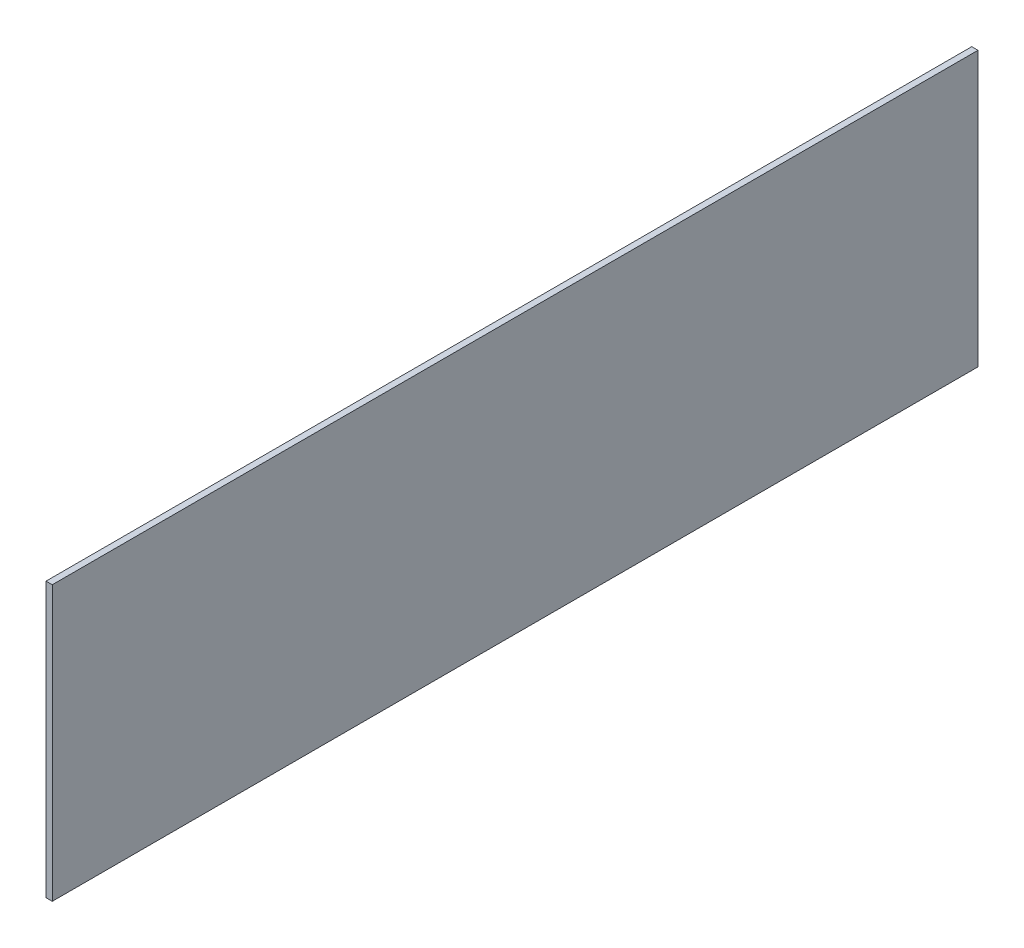
ISO-10303-21;
HEADER;
FILE_DESCRIPTION(('STEP AP214'),'2;1');
FILE_NAME('part.step','',(''),(''),'','','');
FILE_SCHEMA(('AUTOMOTIVE_DESIGN { 1 0 10303 214 1 1 1 1 }'));
ENDSEC;
DATA;
#1=APPLICATION_CONTEXT('core data for automotive mechanical design processes');
#2=APPLICATION_PROTOCOL_DEFINITION('international standard','automotive_design',2000,#1);
#3=PRODUCT_CONTEXT('',#1,'mechanical');
#4=PRODUCT('Part','Part','',(#3));
#5=PRODUCT_RELATED_PRODUCT_CATEGORY('part','',(#4));
#6=PRODUCT_DEFINITION_FORMATION('','',#4);
#7=PRODUCT_DEFINITION_CONTEXT('part definition',#1,'design');
#8=PRODUCT_DEFINITION('design','',#6,#7);
#9=PRODUCT_DEFINITION_SHAPE('','',#8);
#10=(LENGTH_UNIT() NAMED_UNIT(*) SI_UNIT(.MILLI.,.METRE.));
#11=(NAMED_UNIT(*) PLANE_ANGLE_UNIT() SI_UNIT($,.RADIAN.));
#12=(NAMED_UNIT(*) SI_UNIT($,.STERADIAN.) SOLID_ANGLE_UNIT());
#13=UNCERTAINTY_MEASURE_WITH_UNIT(LENGTH_MEASURE(1.E-05),#10,'distance_accuracy_value','');
#14=(GEOMETRIC_REPRESENTATION_CONTEXT(3) GLOBAL_UNCERTAINTY_ASSIGNED_CONTEXT((#13)) GLOBAL_UNIT_ASSIGNED_CONTEXT((#10,
#11,#12)) REPRESENTATION_CONTEXT('',''));
#15=CARTESIAN_POINT('',(0.,0.,0.));
#16=DIRECTION('',(0.,0.,1.));
#17=DIRECTION('',(1.,0.,0.));
#18=AXIS2_PLACEMENT_3D('',#15,#16,#17);
#19=CARTESIAN_POINT('',(-61.2631578947369,127.578947368421,1776.));
#20=DIRECTION('',(1.,0.,0.));
#21=DIRECTION('',(0.,1.,0.));
#22=AXIS2_PLACEMENT_3D('',#19,#20,#21);
#23=PLANE('',#22);
#24=DIRECTION('',(0.,-1.,0.));
#25=VECTOR('',#24,1.);
#26=CARTESIAN_POINT('',(-61.2631578947369,127.578947368421,0.));
#27=LINE('',#26,#25);
#28=CARTESIAN_POINT('',(-61.2631578947369,127.578947368421,0.));
#29=VERTEX_POINT('',#28);
#30=CARTESIAN_POINT('',(-61.2631578947369,-398.421052631579,0.));
#31=VERTEX_POINT('',#30);
#32=EDGE_CURVE('E107',#29,#31,#27,.T.);
#33=ORIENTED_EDGE('',*,*,#32,.T.);
#34=DIRECTION('',(0.,0.,-1.));
#35=VECTOR('',#34,1.);
#36=CARTESIAN_POINT('',(-61.2631578947369,-398.421052631579,1776.));
#37=LINE('',#36,#35);
#38=CARTESIAN_POINT('',(-61.2631578947369,-398.421052631579,1776.));
#39=VERTEX_POINT('',#38);
#40=EDGE_CURVE('E11',#39,#31,#37,.T.);
#41=ORIENTED_EDGE('',*,*,#40,.F.);
#42=DIRECTION('',(0.,-1.,0.));
#43=VECTOR('',#42,1.);
#44=CARTESIAN_POINT('',(-61.2631578947369,127.578947368421,1776.));
#45=LINE('',#44,#43);
#46=CARTESIAN_POINT('',(-61.2631578947369,127.578947368421,1776.));
#47=VERTEX_POINT('',#46);
#48=EDGE_CURVE('E91',#47,#39,#45,.T.);
#49=ORIENTED_EDGE('',*,*,#48,.F.);
#50=DIRECTION('',(0.,0.,-1.));
#51=VECTOR('',#50,1.);
#52=CARTESIAN_POINT('',(-61.2631578947369,127.578947368421,1776.));
#53=LINE('',#52,#51);
#54=EDGE_CURVE('E103',#47,#29,#53,.T.);
#55=ORIENTED_EDGE('',*,*,#54,.T.);
#56=EDGE_LOOP('',(#33,#41,#49,#55));
#57=FACE_BOUND('',#56,.T.);
#58=ADVANCED_FACE('F39',(#57),#23,.F.);
#59=CARTESIAN_POINT('',(-61.2631578947369,-398.421052631579,1776.));
#60=DIRECTION('',(0.,1.,0.));
#61=DIRECTION('',(0.,0.,1.));
#62=AXIS2_PLACEMENT_3D('',#59,#60,#61);
#63=PLANE('',#62);
#64=DIRECTION('',(1.,0.,0.));
#65=VECTOR('',#64,1.);
#66=CARTESIAN_POINT('',(-61.2631578947369,-398.421052631579,0.));
#67=LINE('',#66,#65);
#68=CARTESIAN_POINT('',(-49.2631578947369,-398.421052631579,0.));
#69=VERTEX_POINT('',#68);
#70=EDGE_CURVE('E96',#31,#69,#67,.T.);
#71=ORIENTED_EDGE('',*,*,#70,.T.);
#72=DIRECTION('',(0.,0.,-1.));
#73=VECTOR('',#72,1.);
#74=CARTESIAN_POINT('',(-49.2631578947369,-398.421052631579,1776.));
#75=LINE('',#74,#73);
#76=CARTESIAN_POINT('',(-49.2631578947369,-398.421052631579,1776.));
#77=VERTEX_POINT('',#76);
#78=EDGE_CURVE('E48',#77,#69,#75,.T.);
#79=ORIENTED_EDGE('',*,*,#78,.F.);
#80=DIRECTION('',(1.,0.,0.));
#81=VECTOR('',#80,1.);
#82=CARTESIAN_POINT('',(-61.2631578947369,-398.421052631579,1776.));
#83=LINE('',#82,#81);
#84=EDGE_CURVE('E86',#39,#77,#83,.T.);
#85=ORIENTED_EDGE('',*,*,#84,.F.);
#86=ORIENTED_EDGE('',*,*,#40,.T.);
#87=EDGE_LOOP('',(#71,#79,#85,#86));
#88=FACE_BOUND('',#87,.T.);
#89=ADVANCED_FACE('F95',(#88),#63,.F.);
#90=CARTESIAN_POINT('',(-49.2631578947369,127.578947368421,1776.));
#91=DIRECTION('',(-1.,0.,0.));
#92=DIRECTION('',(0.,-1.,0.));
#93=AXIS2_PLACEMENT_3D('',#90,#91,#92);
#94=PLANE('',#93);
#95=DIRECTION('',(0.,1.,0.));
#96=VECTOR('',#95,1.);
#97=CARTESIAN_POINT('',(-49.2631578947369,127.578947368421,0.));
#98=LINE('',#97,#96);
#99=CARTESIAN_POINT('',(-49.2631578947369,127.578947368421,0.));
#100=VERTEX_POINT('',#99);
#101=EDGE_CURVE('E73',#69,#100,#98,.T.);
#102=ORIENTED_EDGE('',*,*,#101,.T.);
#103=DIRECTION('',(0.,0.,-1.));
#104=VECTOR('',#103,1.);
#105=CARTESIAN_POINT('',(-49.2631578947369,127.578947368421,1776.));
#106=LINE('',#105,#104);
#107=CARTESIAN_POINT('',(-49.2631578947369,127.578947368421,1776.));
#108=VERTEX_POINT('',#107);
#109=EDGE_CURVE('E98',#108,#100,#106,.T.);
#110=ORIENTED_EDGE('',*,*,#109,.F.);
#111=DIRECTION('',(0.,1.,0.));
#112=VECTOR('',#111,1.);
#113=CARTESIAN_POINT('',(-49.2631578947369,127.578947368421,1776.));
#114=LINE('',#113,#112);
#115=EDGE_CURVE('E89',#77,#108,#114,.T.);
#116=ORIENTED_EDGE('',*,*,#115,.F.);
#117=ORIENTED_EDGE('',*,*,#78,.T.);
#118=EDGE_LOOP('',(#102,#110,#116,#117));
#119=FACE_BOUND('',#118,.T.);
#120=ADVANCED_FACE('F99',(#119),#94,.F.);
#121=CARTESIAN_POINT('',(-61.2631578947369,127.578947368421,1776.));
#122=DIRECTION('',(0.,-1.,0.));
#123=DIRECTION('',(0.,0.,-1.));
#124=AXIS2_PLACEMENT_3D('',#121,#122,#123);
#125=PLANE('',#124);
#126=DIRECTION('',(-1.,0.,0.));
#127=VECTOR('',#126,1.);
#128=CARTESIAN_POINT('',(-61.2631578947369,127.578947368421,0.));
#129=LINE('',#128,#127);
#130=EDGE_CURVE('E79',#100,#29,#129,.T.);
#131=ORIENTED_EDGE('',*,*,#130,.T.);
#132=ORIENTED_EDGE('',*,*,#54,.F.);
#133=DIRECTION('',(-1.,0.,0.));
#134=VECTOR('',#133,1.);
#135=CARTESIAN_POINT('',(-61.2631578947369,127.578947368421,1776.));
#136=LINE('',#135,#134);
#137=EDGE_CURVE('E56',#108,#47,#136,.T.);
#138=ORIENTED_EDGE('',*,*,#137,.F.);
#139=ORIENTED_EDGE('',*,*,#109,.T.);
#140=EDGE_LOOP('',(#131,#132,#138,#139));
#141=FACE_BOUND('',#140,.T.);
#142=ADVANCED_FACE('F120',(#141),#125,.F.);
#143=CARTESIAN_POINT('',(0.,0.,1776.));
#144=DIRECTION('',(0.,0.,1.));
#145=DIRECTION('',(1.,0.,0.));
#146=AXIS2_PLACEMENT_3D('',#143,#144,#145);
#147=PLANE('',#146);
#148=ORIENTED_EDGE('',*,*,#48,.T.);
#149=ORIENTED_EDGE('',*,*,#84,.T.);
#150=ORIENTED_EDGE('',*,*,#115,.T.);
#151=ORIENTED_EDGE('',*,*,#137,.T.);
#152=EDGE_LOOP('',(#148,#149,#150,#151));
#153=FACE_BOUND('',#152,.T.);
#154=ADVANCED_FACE('F87',(#153),#147,.T.);
#155=CARTESIAN_POINT('',(0.,0.,0.));
#156=DIRECTION('',(0.,0.,1.));
#157=DIRECTION('',(1.,0.,0.));
#158=AXIS2_PLACEMENT_3D('',#155,#156,#157);
#159=PLANE('',#158);
#160=ORIENTED_EDGE('',*,*,#32,.F.);
#161=ORIENTED_EDGE('',*,*,#130,.F.);
#162=ORIENTED_EDGE('',*,*,#101,.F.);
#163=ORIENTED_EDGE('',*,*,#70,.F.);
#164=EDGE_LOOP('',(#160,#161,#162,#163));
#165=FACE_BOUND('',#164,.T.);
#166=ADVANCED_FACE('F123',(#165),#159,.F.);
#167=CLOSED_SHELL('',(#58,#89,#120,#142,#154,#166));
#168=MANIFOLD_SOLID_BREP('B2',#167);
#169=ADVANCED_BREP_SHAPE_REPRESENTATION('',(#18,#168),#14);
#170=SHAPE_DEFINITION_REPRESENTATION(#9,#169);
ENDSEC;
END-ISO-10303-21;
